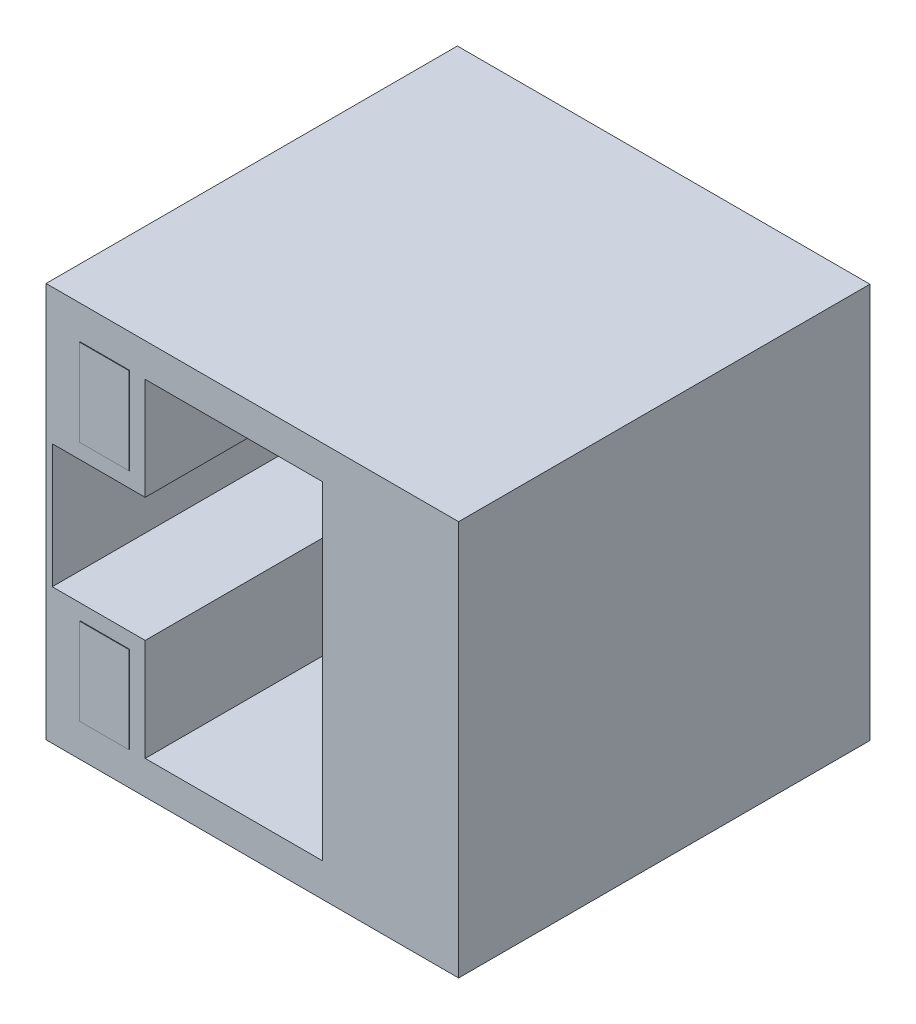
ISO-10303-21;
HEADER;
FILE_DESCRIPTION(('STEP AP214'),'2;1');
FILE_NAME('part.step','',(''),(''),'','','');
FILE_SCHEMA(('AUTOMOTIVE_DESIGN { 1 0 10303 214 1 1 1 1 }'));
ENDSEC;
DATA;
#1=APPLICATION_CONTEXT('core data for automotive mechanical design processes');
#2=APPLICATION_PROTOCOL_DEFINITION('international standard','automotive_design',2000,#1);
#3=PRODUCT_CONTEXT('',#1,'mechanical');
#4=PRODUCT('Part','Part','',(#3));
#5=PRODUCT_RELATED_PRODUCT_CATEGORY('part','',(#4));
#6=PRODUCT_DEFINITION_FORMATION('','',#4);
#7=PRODUCT_DEFINITION_CONTEXT('part definition',#1,'design');
#8=PRODUCT_DEFINITION('design','',#6,#7);
#9=PRODUCT_DEFINITION_SHAPE('','',#8);
#10=(LENGTH_UNIT() NAMED_UNIT(*) SI_UNIT(.MILLI.,.METRE.));
#11=(NAMED_UNIT(*) PLANE_ANGLE_UNIT() SI_UNIT($,.RADIAN.));
#12=(NAMED_UNIT(*) SI_UNIT($,.STERADIAN.) SOLID_ANGLE_UNIT());
#13=UNCERTAINTY_MEASURE_WITH_UNIT(LENGTH_MEASURE(1.E-05),#10,'distance_accuracy_value','');
#14=(GEOMETRIC_REPRESENTATION_CONTEXT(3) GLOBAL_UNCERTAINTY_ASSIGNED_CONTEXT((#13)) GLOBAL_UNIT_ASSIGNED_CONTEXT((#10,
#11,#12)) REPRESENTATION_CONTEXT('',''));
#15=CARTESIAN_POINT('',(0.,0.,0.));
#16=DIRECTION('',(0.,0.,1.));
#17=DIRECTION('',(1.,0.,0.));
#18=AXIS2_PLACEMENT_3D('',#15,#16,#17);
#19=CARTESIAN_POINT('',(8.4582,-8.1026,8.4328));
#20=DIRECTION('',(1.,0.,0.));
#21=DIRECTION('',(0.,0.,-1.));
#22=AXIS2_PLACEMENT_3D('',#19,#20,#21);
#23=PLANE('',#22);
#24=DIRECTION('',(0.,0.,-1.));
#25=VECTOR('',#24,1.);
#26=CARTESIAN_POINT('',(8.4582,8.1026,8.4328));
#27=LINE('',#26,#25);
#28=CARTESIAN_POINT('',(8.4582,8.1026,8.4328));
#29=VERTEX_POINT('',#28);
#30=CARTESIAN_POINT('',(8.4582,8.1026,-8.4328));
#31=VERTEX_POINT('',#30);
#32=EDGE_CURVE('E258',#29,#31,#27,.T.);
#33=ORIENTED_EDGE('',*,*,#32,.F.);
#34=DIRECTION('',(0.,1.,0.));
#35=VECTOR('',#34,1.);
#36=CARTESIAN_POINT('',(8.4582,-8.1026,8.4328));
#37=LINE('',#36,#35);
#38=CARTESIAN_POINT('',(8.4582,-8.1026,8.4328));
#39=VERTEX_POINT('',#38);
#40=EDGE_CURVE('E11',#39,#29,#37,.T.);
#41=ORIENTED_EDGE('',*,*,#40,.F.);
#42=DIRECTION('',(0.,0.,-1.));
#43=VECTOR('',#42,1.);
#44=CARTESIAN_POINT('',(8.4582,-8.1026,8.4328));
#45=LINE('',#44,#43);
#46=CARTESIAN_POINT('',(8.4582,-8.1026,-8.4328));
#47=VERTEX_POINT('',#46);
#48=EDGE_CURVE('E283',#39,#47,#45,.T.);
#49=ORIENTED_EDGE('',*,*,#48,.T.);
#50=DIRECTION('',(0.,1.,0.));
#51=VECTOR('',#50,1.);
#52=CARTESIAN_POINT('',(8.4582,-8.1026,-8.4328));
#53=LINE('',#52,#51);
#54=EDGE_CURVE('E35',#47,#31,#53,.T.);
#55=ORIENTED_EDGE('',*,*,#54,.T.);
#56=EDGE_LOOP('',(#33,#41,#49,#55));
#57=FACE_BOUND('',#56,.T.);
#58=ADVANCED_FACE('F32',(#57),#23,.T.);
#59=CARTESIAN_POINT('',(-8.4582,-8.1026,8.4328));
#60=DIRECTION('',(0.,0.,1.));
#61=DIRECTION('',(1.,0.,0.));
#62=AXIS2_PLACEMENT_3D('',#59,#60,#61);
#63=PLANE('',#62);
#64=DIRECTION('',(0.,1.,0.));
#65=VECTOR('',#64,1.);
#66=CARTESIAN_POINT('',(-8.2042,-2.54,8.4328));
#67=LINE('',#66,#65);
#68=CARTESIAN_POINT('',(-8.2042,-2.54,8.4328));
#69=VERTEX_POINT('',#68);
#70=CARTESIAN_POINT('',(-8.2042,2.54,8.4328));
#71=VERTEX_POINT('',#70);
#72=EDGE_CURVE('E181',#69,#71,#67,.T.);
#73=ORIENTED_EDGE('',*,*,#72,.T.);
#74=DIRECTION('',(1.,0.,0.));
#75=VECTOR('',#74,1.);
#76=CARTESIAN_POINT('',(-8.2042,2.54,8.4328));
#77=LINE('',#76,#75);
#78=CARTESIAN_POINT('',(-4.3942,2.54,8.4328));
#79=VERTEX_POINT('',#78);
#80=EDGE_CURVE('E167',#71,#79,#77,.T.);
#81=ORIENTED_EDGE('',*,*,#80,.T.);
#82=DIRECTION('',(0.,1.,0.));
#83=VECTOR('',#82,1.);
#84=CARTESIAN_POINT('',(-4.3942,2.54,8.4328));
#85=LINE('',#84,#83);
#86=CARTESIAN_POINT('',(-4.3942,6.731,8.4328));
#87=VERTEX_POINT('',#86);
#88=EDGE_CURVE('E595',#79,#87,#85,.T.);
#89=ORIENTED_EDGE('',*,*,#88,.T.);
#90=DIRECTION('',(1.,0.,0.));
#91=VECTOR('',#90,1.);
#92=CARTESIAN_POINT('',(-4.3942,6.731,8.4328));
#93=LINE('',#92,#91);
#94=CARTESIAN_POINT('',(2.8702,6.731,8.4328));
#95=VERTEX_POINT('',#94);
#96=EDGE_CURVE('E592',#87,#95,#93,.T.);
#97=ORIENTED_EDGE('',*,*,#96,.T.);
#98=DIRECTION('',(0.,-1.,0.));
#99=VECTOR('',#98,1.);
#100=CARTESIAN_POINT('',(2.8702,6.731,8.4328));
#101=LINE('',#100,#99);
#102=CARTESIAN_POINT('',(2.8702,-6.731,8.4328));
#103=VERTEX_POINT('',#102);
#104=EDGE_CURVE('E589',#95,#103,#101,.T.);
#105=ORIENTED_EDGE('',*,*,#104,.T.);
#106=DIRECTION('',(-1.,0.,0.));
#107=VECTOR('',#106,1.);
#108=CARTESIAN_POINT('',(2.8702,-6.731,8.4328));
#109=LINE('',#108,#107);
#110=CARTESIAN_POINT('',(-4.3942,-6.731,8.4328));
#111=VERTEX_POINT('',#110);
#112=EDGE_CURVE('E587',#103,#111,#109,.T.);
#113=ORIENTED_EDGE('',*,*,#112,.T.);
#114=DIRECTION('',(0.,1.,0.));
#115=VECTOR('',#114,1.);
#116=CARTESIAN_POINT('',(-4.3942,-6.731,8.4328));
#117=LINE('',#116,#115);
#118=CARTESIAN_POINT('',(-4.3942,-2.54,8.4328));
#119=VERTEX_POINT('',#118);
#120=EDGE_CURVE('E194',#111,#119,#117,.T.);
#121=ORIENTED_EDGE('',*,*,#120,.T.);
#122=DIRECTION('',(-1.,0.,0.));
#123=VECTOR('',#122,1.);
#124=CARTESIAN_POINT('',(-4.3942,-2.54,8.4328));
#125=LINE('',#124,#123);
#126=EDGE_CURVE('E190',#119,#69,#125,.T.);
#127=ORIENTED_EDGE('',*,*,#126,.T.);
#128=EDGE_LOOP('',(#73,#81,#89,#97,#105,#113,#121,#127));
#129=FACE_BOUND('',#128,.T.);
#130=DIRECTION('',(1.,0.,0.));
#131=VECTOR('',#130,1.);
#132=CARTESIAN_POINT('',(-5.0292,6.731,8.43279999998003));
#133=LINE('',#132,#131);
#134=CARTESIAN_POINT('',(-7.0612,6.731,8.4328));
#135=VERTEX_POINT('',#134);
#136=CARTESIAN_POINT('',(-5.0292,6.731,8.43279999998003));
#137=VERTEX_POINT('',#136);
#138=EDGE_CURVE('E245',#135,#137,#133,.T.);
#139=ORIENTED_EDGE('',*,*,#138,.T.);
#140=DIRECTION('',(0.,-1.,0.));
#141=VECTOR('',#140,1.);
#142=CARTESIAN_POINT('',(-5.0292,3.175,8.43279999998003));
#143=LINE('',#142,#141);
#144=CARTESIAN_POINT('',(-5.0292,3.175,8.4328));
#145=VERTEX_POINT('',#144);
#146=EDGE_CURVE('E175',#137,#145,#143,.T.);
#147=ORIENTED_EDGE('',*,*,#146,.T.);
#148=DIRECTION('',(-1.,0.,0.));
#149=VECTOR('',#148,1.);
#150=CARTESIAN_POINT('',(-7.0612,3.175,8.43279999998003));
#151=LINE('',#150,#149);
#152=CARTESIAN_POINT('',(-7.0612,3.175,8.4328));
#153=VERTEX_POINT('',#152);
#154=EDGE_CURVE('E252',#145,#153,#151,.T.);
#155=ORIENTED_EDGE('',*,*,#154,.T.);
#156=DIRECTION('',(0.,1.,0.));
#157=VECTOR('',#156,1.);
#158=CARTESIAN_POINT('',(-7.0612,6.731,8.43279999998003));
#159=LINE('',#158,#157);
#160=EDGE_CURVE('E56',#153,#135,#159,.T.);
#161=ORIENTED_EDGE('',*,*,#160,.T.);
#162=EDGE_LOOP('',(#139,#147,#155,#161));
#163=FACE_BOUND('',#162,.T.);
#164=DIRECTION('',(1.,0.,0.));
#165=VECTOR('',#164,1.);
#166=CARTESIAN_POINT('',(-5.0292,-3.175,8.43279999998003));
#167=LINE('',#166,#165);
#168=CARTESIAN_POINT('',(-7.0612,-3.175,8.4328));
#169=VERTEX_POINT('',#168);
#170=CARTESIAN_POINT('',(-5.0292,-3.175,8.43279999998003));
#171=VERTEX_POINT('',#170);
#172=EDGE_CURVE('E272',#169,#171,#167,.T.);
#173=ORIENTED_EDGE('',*,*,#172,.T.);
#174=DIRECTION('',(0.,-1.,0.));
#175=VECTOR('',#174,1.);
#176=CARTESIAN_POINT('',(-5.0292,-6.731,8.43279999998003));
#177=LINE('',#176,#175);
#178=CARTESIAN_POINT('',(-5.0292,-6.731,8.4328));
#179=VERTEX_POINT('',#178);
#180=EDGE_CURVE('E231',#171,#179,#177,.T.);
#181=ORIENTED_EDGE('',*,*,#180,.T.);
#182=DIRECTION('',(-1.,0.,0.));
#183=VECTOR('',#182,1.);
#184=CARTESIAN_POINT('',(-7.0612,-6.731,8.43279999998003));
#185=LINE('',#184,#183);
#186=CARTESIAN_POINT('',(-7.0612,-6.731,8.4328));
#187=VERTEX_POINT('',#186);
#188=EDGE_CURVE('E280',#179,#187,#185,.T.);
#189=ORIENTED_EDGE('',*,*,#188,.T.);
#190=DIRECTION('',(0.,1.,0.));
#191=VECTOR('',#190,1.);
#192=CARTESIAN_POINT('',(-7.0612,-3.175,8.43279999998003));
#193=LINE('',#192,#191);
#194=EDGE_CURVE('E278',#187,#169,#193,.T.);
#195=ORIENTED_EDGE('',*,*,#194,.T.);
#196=EDGE_LOOP('',(#173,#181,#189,#195));
#197=FACE_BOUND('',#196,.T.);
#198=DIRECTION('',(1.,0.,0.));
#199=VECTOR('',#198,1.);
#200=CARTESIAN_POINT('',(-8.4582,8.1026,8.4328));
#201=LINE('',#200,#199);
#202=CARTESIAN_POINT('',(-8.4582,8.1026,8.4328));
#203=VERTEX_POINT('',#202);
#204=EDGE_CURVE('E287',#203,#29,#201,.T.);
#205=ORIENTED_EDGE('',*,*,#204,.F.);
#206=DIRECTION('',(0.,1.,0.));
#207=VECTOR('',#206,1.);
#208=CARTESIAN_POINT('',(-8.4582,-8.1026,8.4328));
#209=LINE('',#208,#207);
#210=CARTESIAN_POINT('',(-8.4582,-8.1026,8.4328));
#211=VERTEX_POINT('',#210);
#212=EDGE_CURVE('E40',#211,#203,#209,.T.);
#213=ORIENTED_EDGE('',*,*,#212,.F.);
#214=DIRECTION('',(1.,0.,0.));
#215=VECTOR('',#214,1.);
#216=CARTESIAN_POINT('',(-8.4582,-8.1026,8.4328));
#217=LINE('',#216,#215);
#218=EDGE_CURVE('E293',#211,#39,#217,.T.);
#219=ORIENTED_EDGE('',*,*,#218,.T.);
#220=ORIENTED_EDGE('',*,*,#40,.T.);
#221=EDGE_LOOP('',(#205,#213,#219,#220));
#222=FACE_BOUND('',#221,.T.);
#223=ADVANCED_FACE('F188',(#129,#163,#197,#222),#63,.T.);
#224=CARTESIAN_POINT('',(-8.4582,-8.1026,-8.4328));
#225=DIRECTION('',(-1.,0.,0.));
#226=DIRECTION('',(0.,0.,1.));
#227=AXIS2_PLACEMENT_3D('',#224,#225,#226);
#228=PLANE('',#227);
#229=DIRECTION('',(0.,0.,1.));
#230=VECTOR('',#229,1.);
#231=CARTESIAN_POINT('',(-8.4582,8.1026,-8.4328));
#232=LINE('',#231,#230);
#233=CARTESIAN_POINT('',(-8.4582,8.1026,-8.4328));
#234=VERTEX_POINT('',#233);
#235=EDGE_CURVE('E301',#234,#203,#232,.T.);
#236=ORIENTED_EDGE('',*,*,#235,.F.);
#237=DIRECTION('',(0.,1.,0.));
#238=VECTOR('',#237,1.);
#239=CARTESIAN_POINT('',(-8.4582,-8.1026,-8.4328));
#240=LINE('',#239,#238);
#241=CARTESIAN_POINT('',(-8.4582,-8.1026,-8.4328));
#242=VERTEX_POINT('',#241);
#243=EDGE_CURVE('E306',#242,#234,#240,.T.);
#244=ORIENTED_EDGE('',*,*,#243,.F.);
#245=DIRECTION('',(0.,0.,1.));
#246=VECTOR('',#245,1.);
#247=CARTESIAN_POINT('',(-8.4582,-8.1026,-8.4328));
#248=LINE('',#247,#246);
#249=EDGE_CURVE('E290',#242,#211,#248,.T.);
#250=ORIENTED_EDGE('',*,*,#249,.T.);
#251=ORIENTED_EDGE('',*,*,#212,.T.);
#252=EDGE_LOOP('',(#236,#244,#250,#251));
#253=FACE_BOUND('',#252,.T.);
#254=ADVANCED_FACE('F324',(#253),#228,.T.);
#255=CARTESIAN_POINT('',(8.4582,-8.1026,-8.4328));
#256=DIRECTION('',(0.,0.,-1.));
#257=DIRECTION('',(-1.,0.,0.));
#258=AXIS2_PLACEMENT_3D('',#255,#256,#257);
#259=PLANE('',#258);
#260=DIRECTION('',(-1.,0.,0.));
#261=VECTOR('',#260,1.);
#262=CARTESIAN_POINT('',(8.4582,8.1026,-8.4328));
#263=LINE('',#262,#261);
#264=EDGE_CURVE('E298',#31,#234,#263,.T.);
#265=ORIENTED_EDGE('',*,*,#264,.F.);
#266=ORIENTED_EDGE('',*,*,#54,.F.);
#267=DIRECTION('',(-1.,0.,0.));
#268=VECTOR('',#267,1.);
#269=CARTESIAN_POINT('',(8.4582,-8.1026,-8.4328));
#270=LINE('',#269,#268);
#271=EDGE_CURVE('E286',#47,#242,#270,.T.);
#272=ORIENTED_EDGE('',*,*,#271,.T.);
#273=ORIENTED_EDGE('',*,*,#243,.T.);
#274=EDGE_LOOP('',(#265,#266,#272,#273));
#275=FACE_BOUND('',#274,.T.);
#276=ADVANCED_FACE('F314',(#275),#259,.T.);
#277=CARTESIAN_POINT('',(8.4582,-8.1026,-8.4328));
#278=DIRECTION('',(0.,1.,0.));
#279=DIRECTION('',(0.,0.,1.));
#280=AXIS2_PLACEMENT_3D('',#277,#278,#279);
#281=PLANE('',#280);
#282=ORIENTED_EDGE('',*,*,#48,.F.);
#283=ORIENTED_EDGE('',*,*,#218,.F.);
#284=ORIENTED_EDGE('',*,*,#249,.F.);
#285=ORIENTED_EDGE('',*,*,#271,.F.);
#286=EDGE_LOOP('',(#282,#283,#284,#285));
#287=FACE_BOUND('',#286,.T.);
#288=ADVANCED_FACE('F321',(#287),#281,.F.);
#289=CARTESIAN_POINT('',(8.4582,8.1026,-8.4328));
#290=DIRECTION('',(0.,1.,0.));
#291=DIRECTION('',(0.,0.,1.));
#292=AXIS2_PLACEMENT_3D('',#289,#290,#291);
#293=PLANE('',#292);
#294=ORIENTED_EDGE('',*,*,#32,.T.);
#295=ORIENTED_EDGE('',*,*,#264,.T.);
#296=ORIENTED_EDGE('',*,*,#235,.T.);
#297=ORIENTED_EDGE('',*,*,#204,.T.);
#298=EDGE_LOOP('',(#294,#295,#296,#297));
#299=FACE_BOUND('',#298,.T.);
#300=ADVANCED_FACE('F316',(#299),#293,.T.);
#301=CARTESIAN_POINT('',(-5.0292,-3.175,-500000.));
#302=DIRECTION('',(0.,1.,0.));
#303=DIRECTION('',(0.,0.,1.));
#304=AXIS2_PLACEMENT_3D('',#301,#302,#303);
#305=PLANE('',#304);
#306=ORIENTED_EDGE('',*,*,#172,.F.);
#307=DIRECTION('',(0.,0.,1.));
#308=VECTOR('',#307,1.);
#309=CARTESIAN_POINT('',(-7.0612,-3.175,-500000.));
#310=LINE('',#309,#308);
#311=CARTESIAN_POINT('',(-7.0612,-3.175,8.4582));
#312=VERTEX_POINT('',#311);
#313=EDGE_CURVE('E269',#169,#312,#310,.T.);
#314=ORIENTED_EDGE('',*,*,#313,.T.);
#315=DIRECTION('',(-1.,0.,0.));
#316=VECTOR('',#315,1.);
#317=CARTESIAN_POINT('',(-5.0292,-3.175,8.4582));
#318=LINE('',#317,#316);
#319=CARTESIAN_POINT('',(-5.0292,-3.175,8.4582));
#320=VERTEX_POINT('',#319);
#321=EDGE_CURVE('E255',#320,#312,#318,.T.);
#322=ORIENTED_EDGE('',*,*,#321,.F.);
#323=DIRECTION('',(0.,0.,1.));
#324=VECTOR('',#323,1.);
#325=CARTESIAN_POINT('',(-5.0292,-3.175,-500000.));
#326=LINE('',#325,#324);
#327=EDGE_CURVE('E264',#171,#320,#326,.T.);
#328=ORIENTED_EDGE('',*,*,#327,.F.);
#329=EDGE_LOOP('',(#306,#314,#322,#328));
#330=FACE_BOUND('',#329,.T.);
#331=ADVANCED_FACE('F441',(#330),#305,.T.);
#332=CARTESIAN_POINT('',(-7.0612,-3.175,-500000.));
#333=DIRECTION('',(-1.,0.,0.));
#334=DIRECTION('',(0.,0.,1.));
#335=AXIS2_PLACEMENT_3D('',#332,#333,#334);
#336=PLANE('',#335);
#337=ORIENTED_EDGE('',*,*,#194,.F.);
#338=DIRECTION('',(0.,0.,1.));
#339=VECTOR('',#338,1.);
#340=CARTESIAN_POINT('',(-7.0612,-6.731,-500000.));
#341=LINE('',#340,#339);
#342=CARTESIAN_POINT('',(-7.0612,-6.731,8.4582));
#343=VERTEX_POINT('',#342);
#344=EDGE_CURVE('E271',#187,#343,#341,.T.);
#345=ORIENTED_EDGE('',*,*,#344,.T.);
#346=DIRECTION('',(0.,-1.,0.));
#347=VECTOR('',#346,1.);
#348=CARTESIAN_POINT('',(-7.0612,-3.175,8.4582));
#349=LINE('',#348,#347);
#350=EDGE_CURVE('E259',#312,#343,#349,.T.);
#351=ORIENTED_EDGE('',*,*,#350,.F.);
#352=ORIENTED_EDGE('',*,*,#313,.F.);
#353=EDGE_LOOP('',(#337,#345,#351,#352));
#354=FACE_BOUND('',#353,.T.);
#355=ADVANCED_FACE('F463',(#354),#336,.T.);
#356=CARTESIAN_POINT('',(-7.0612,-6.731,-500000.));
#357=DIRECTION('',(0.,-1.,0.));
#358=DIRECTION('',(0.,0.,-1.));
#359=AXIS2_PLACEMENT_3D('',#356,#357,#358);
#360=PLANE('',#359);
#361=ORIENTED_EDGE('',*,*,#188,.F.);
#362=DIRECTION('',(0.,0.,1.));
#363=VECTOR('',#362,1.);
#364=CARTESIAN_POINT('',(-5.0292,-6.731,-500000.));
#365=LINE('',#364,#363);
#366=CARTESIAN_POINT('',(-5.0292,-6.731,8.4582));
#367=VERTEX_POINT('',#366);
#368=EDGE_CURVE('E274',#179,#367,#365,.T.);
#369=ORIENTED_EDGE('',*,*,#368,.T.);
#370=DIRECTION('',(1.,0.,0.));
#371=VECTOR('',#370,1.);
#372=CARTESIAN_POINT('',(-7.0612,-6.731,8.4582));
#373=LINE('',#372,#371);
#374=EDGE_CURVE('E263',#343,#367,#373,.T.);
#375=ORIENTED_EDGE('',*,*,#374,.F.);
#376=ORIENTED_EDGE('',*,*,#344,.F.);
#377=EDGE_LOOP('',(#361,#369,#375,#376));
#378=FACE_BOUND('',#377,.T.);
#379=ADVANCED_FACE('F467',(#378),#360,.T.);
#380=CARTESIAN_POINT('',(-5.0292,-6.731,-500000.));
#381=DIRECTION('',(1.,0.,0.));
#382=DIRECTION('',(0.,0.,-1.));
#383=AXIS2_PLACEMENT_3D('',#380,#381,#382);
#384=PLANE('',#383);
#385=ORIENTED_EDGE('',*,*,#180,.F.);
#386=ORIENTED_EDGE('',*,*,#327,.T.);
#387=DIRECTION('',(0.,1.,0.));
#388=VECTOR('',#387,1.);
#389=CARTESIAN_POINT('',(-5.0292,-6.731,8.4582));
#390=LINE('',#389,#388);
#391=EDGE_CURVE('E260',#367,#320,#390,.T.);
#392=ORIENTED_EDGE('',*,*,#391,.F.);
#393=ORIENTED_EDGE('',*,*,#368,.F.);
#394=EDGE_LOOP('',(#385,#386,#392,#393));
#395=FACE_BOUND('',#394,.T.);
#396=ADVANCED_FACE('F459',(#395),#384,.T.);
#397=CARTESIAN_POINT('',(-7.0612,-3.175,8.4582));
#398=DIRECTION('',(0.,0.,1.));
#399=DIRECTION('',(1.,0.,0.));
#400=AXIS2_PLACEMENT_3D('',#397,#398,#399);
#401=PLANE('',#400);
#402=ORIENTED_EDGE('',*,*,#321,.T.);
#403=ORIENTED_EDGE('',*,*,#350,.T.);
#404=ORIENTED_EDGE('',*,*,#374,.T.);
#405=ORIENTED_EDGE('',*,*,#391,.T.);
#406=EDGE_LOOP('',(#402,#403,#404,#405));
#407=FACE_BOUND('',#406,.T.);
#408=ADVANCED_FACE('F445',(#407),#401,.T.);
#409=CARTESIAN_POINT('',(-5.0292,6.731,-500000.));
#410=DIRECTION('',(0.,1.,0.));
#411=DIRECTION('',(0.,0.,1.));
#412=AXIS2_PLACEMENT_3D('',#409,#410,#411);
#413=PLANE('',#412);
#414=ORIENTED_EDGE('',*,*,#138,.F.);
#415=DIRECTION('',(0.,0.,1.));
#416=VECTOR('',#415,1.);
#417=CARTESIAN_POINT('',(-7.0612,6.731,-500000.));
#418=LINE('',#417,#416);
#419=CARTESIAN_POINT('',(-7.0612,6.731,8.4582));
#420=VERTEX_POINT('',#419);
#421=EDGE_CURVE('E242',#135,#420,#418,.T.);
#422=ORIENTED_EDGE('',*,*,#421,.T.);
#423=DIRECTION('',(-1.,0.,0.));
#424=VECTOR('',#423,1.);
#425=CARTESIAN_POINT('',(-5.0292,6.731,8.4582));
#426=LINE('',#425,#424);
#427=CARTESIAN_POINT('',(-5.0292,6.731,8.4582));
#428=VERTEX_POINT('',#427);
#429=EDGE_CURVE('E228',#428,#420,#426,.T.);
#430=ORIENTED_EDGE('',*,*,#429,.F.);
#431=DIRECTION('',(0.,0.,1.));
#432=VECTOR('',#431,1.);
#433=CARTESIAN_POINT('',(-5.0292,6.731,-500000.));
#434=LINE('',#433,#432);
#435=EDGE_CURVE('E237',#137,#428,#434,.T.);
#436=ORIENTED_EDGE('',*,*,#435,.F.);
#437=EDGE_LOOP('',(#414,#422,#430,#436));
#438=FACE_BOUND('',#437,.T.);
#439=ADVANCED_FACE('F357',(#438),#413,.T.);
#440=CARTESIAN_POINT('',(-7.0612,6.731,-500000.));
#441=DIRECTION('',(-1.,0.,0.));
#442=DIRECTION('',(0.,0.,1.));
#443=AXIS2_PLACEMENT_3D('',#440,#441,#442);
#444=PLANE('',#443);
#445=ORIENTED_EDGE('',*,*,#160,.F.);
#446=DIRECTION('',(0.,0.,1.));
#447=VECTOR('',#446,1.);
#448=CARTESIAN_POINT('',(-7.0612,3.175,-500000.));
#449=LINE('',#448,#447);
#450=CARTESIAN_POINT('',(-7.0612,3.175,8.4582));
#451=VERTEX_POINT('',#450);
#452=EDGE_CURVE('E244',#153,#451,#449,.T.);
#453=ORIENTED_EDGE('',*,*,#452,.T.);
#454=DIRECTION('',(0.,-1.,0.));
#455=VECTOR('',#454,1.);
#456=CARTESIAN_POINT('',(-7.0612,6.731,8.4582));
#457=LINE('',#456,#455);
#458=EDGE_CURVE('E232',#420,#451,#457,.T.);
#459=ORIENTED_EDGE('',*,*,#458,.F.);
#460=ORIENTED_EDGE('',*,*,#421,.F.);
#461=EDGE_LOOP('',(#445,#453,#459,#460));
#462=FACE_BOUND('',#461,.T.);
#463=ADVANCED_FACE('F444',(#462),#444,.T.);
#464=CARTESIAN_POINT('',(-7.0612,3.175,-500000.));
#465=DIRECTION('',(0.,-1.,0.));
#466=DIRECTION('',(0.,0.,-1.));
#467=AXIS2_PLACEMENT_3D('',#464,#465,#466);
#468=PLANE('',#467);
#469=ORIENTED_EDGE('',*,*,#154,.F.);
#470=DIRECTION('',(0.,0.,1.));
#471=VECTOR('',#470,1.);
#472=CARTESIAN_POINT('',(-5.0292,3.175,-500000.));
#473=LINE('',#472,#471);
#474=CARTESIAN_POINT('',(-5.0292,3.175,8.4582));
#475=VERTEX_POINT('',#474);
#476=EDGE_CURVE('E247',#145,#475,#473,.T.);
#477=ORIENTED_EDGE('',*,*,#476,.T.);
#478=DIRECTION('',(1.,0.,0.));
#479=VECTOR('',#478,1.);
#480=CARTESIAN_POINT('',(-7.0612,3.175,8.4582));
#481=LINE('',#480,#479);
#482=EDGE_CURVE('E236',#451,#475,#481,.T.);
#483=ORIENTED_EDGE('',*,*,#482,.F.);
#484=ORIENTED_EDGE('',*,*,#452,.F.);
#485=EDGE_LOOP('',(#469,#477,#483,#484));
#486=FACE_BOUND('',#485,.T.);
#487=ADVANCED_FACE('F449',(#486),#468,.T.);
#488=CARTESIAN_POINT('',(-5.0292,3.175,-500000.));
#489=DIRECTION('',(1.,0.,0.));
#490=DIRECTION('',(0.,0.,-1.));
#491=AXIS2_PLACEMENT_3D('',#488,#489,#490);
#492=PLANE('',#491);
#493=ORIENTED_EDGE('',*,*,#146,.F.);
#494=ORIENTED_EDGE('',*,*,#435,.T.);
#495=DIRECTION('',(0.,1.,0.));
#496=VECTOR('',#495,1.);
#497=CARTESIAN_POINT('',(-5.0292,3.175,8.4582));
#498=LINE('',#497,#496);
#499=EDGE_CURVE('E233',#475,#428,#498,.T.);
#500=ORIENTED_EDGE('',*,*,#499,.F.);
#501=ORIENTED_EDGE('',*,*,#476,.F.);
#502=EDGE_LOOP('',(#493,#494,#500,#501));
#503=FACE_BOUND('',#502,.T.);
#504=ADVANCED_FACE('F439',(#503),#492,.T.);
#505=CARTESIAN_POINT('',(-7.0612,6.731,8.4582));
#506=DIRECTION('',(0.,0.,1.));
#507=DIRECTION('',(1.,0.,0.));
#508=AXIS2_PLACEMENT_3D('',#505,#506,#507);
#509=PLANE('',#508);
#510=ORIENTED_EDGE('',*,*,#429,.T.);
#511=ORIENTED_EDGE('',*,*,#458,.T.);
#512=ORIENTED_EDGE('',*,*,#482,.T.);
#513=ORIENTED_EDGE('',*,*,#499,.T.);
#514=EDGE_LOOP('',(#510,#511,#512,#513));
#515=FACE_BOUND('',#514,.T.);
#516=ADVANCED_FACE('F346',(#515),#509,.T.);
#517=CARTESIAN_POINT('',(-8.2042,-2.54,8.4592));
#518=DIRECTION('',(-1.,0.,0.));
#519=DIRECTION('',(0.,0.,1.));
#520=AXIS2_PLACEMENT_3D('',#517,#518,#519);
#521=PLANE('',#520);
#522=DIRECTION('',(0.,0.,-1.));
#523=VECTOR('',#522,1.);
#524=CARTESIAN_POINT('',(-8.2042,-2.54,8.4592));
#525=LINE('',#524,#523);
#526=CARTESIAN_POINT('',(-8.2042,-2.54,-1.7272));
#527=VERTEX_POINT('',#526);
#528=EDGE_CURVE('E176',#69,#527,#525,.T.);
#529=ORIENTED_EDGE('',*,*,#528,.T.);
#530=DIRECTION('',(0.,1.,0.));
#531=VECTOR('',#530,1.);
#532=CARTESIAN_POINT('',(-8.2042,-2.54,-1.7272));
#533=LINE('',#532,#531);
#534=CARTESIAN_POINT('',(-8.2042,2.54,-1.7272));
#535=VERTEX_POINT('',#534);
#536=EDGE_CURVE('E184',#527,#535,#533,.T.);
#537=ORIENTED_EDGE('',*,*,#536,.T.);
#538=DIRECTION('',(0.,0.,-1.));
#539=VECTOR('',#538,1.);
#540=CARTESIAN_POINT('',(-8.2042,2.54,8.4592));
#541=LINE('',#540,#539);
#542=EDGE_CURVE('E170',#71,#535,#541,.T.);
#543=ORIENTED_EDGE('',*,*,#542,.F.);
#544=ORIENTED_EDGE('',*,*,#72,.F.);
#545=EDGE_LOOP('',(#529,#537,#543,#544));
#546=FACE_BOUND('',#545,.T.);
#547=ADVANCED_FACE('F180',(#546),#521,.F.);
#548=CARTESIAN_POINT('',(-4.3942,-2.54,8.4592));
#549=DIRECTION('',(0.,-1.,0.));
#550=DIRECTION('',(0.,0.,-1.));
#551=AXIS2_PLACEMENT_3D('',#548,#549,#550);
#552=PLANE('',#551);
#553=DIRECTION('',(0.,0.,-1.));
#554=VECTOR('',#553,1.);
#555=CARTESIAN_POINT('',(-4.3942,-2.54,8.4592));
#556=LINE('',#555,#554);
#557=CARTESIAN_POINT('',(-4.3942,-2.54,-1.7272));
#558=VERTEX_POINT('',#557);
#559=EDGE_CURVE('E217',#119,#558,#556,.T.);
#560=ORIENTED_EDGE('',*,*,#559,.T.);
#561=DIRECTION('',(-1.,0.,0.));
#562=VECTOR('',#561,1.);
#563=CARTESIAN_POINT('',(-4.3942,-2.54,-1.7272));
#564=LINE('',#563,#562);
#565=EDGE_CURVE('E185',#558,#527,#564,.T.);
#566=ORIENTED_EDGE('',*,*,#565,.T.);
#567=ORIENTED_EDGE('',*,*,#528,.F.);
#568=ORIENTED_EDGE('',*,*,#126,.F.);
#569=EDGE_LOOP('',(#560,#566,#567,#568));
#570=FACE_BOUND('',#569,.T.);
#571=ADVANCED_FACE('F355',(#570),#552,.F.);
#572=CARTESIAN_POINT('',(-4.3942,-6.731,8.4592));
#573=DIRECTION('',(-1.,0.,0.));
#574=DIRECTION('',(0.,0.,1.));
#575=AXIS2_PLACEMENT_3D('',#572,#573,#574);
#576=PLANE('',#575);
#577=DIRECTION('',(0.,0.,-1.));
#578=VECTOR('',#577,1.);
#579=CARTESIAN_POINT('',(-4.3942,-6.731,8.4592));
#580=LINE('',#579,#578);
#581=CARTESIAN_POINT('',(-4.3942,-6.731,-1.7272));
#582=VERTEX_POINT('',#581);
#583=EDGE_CURVE('E219',#111,#582,#580,.T.);
#584=ORIENTED_EDGE('',*,*,#583,.T.);
#585=DIRECTION('',(0.,1.,0.));
#586=VECTOR('',#585,1.);
#587=CARTESIAN_POINT('',(-4.3942,-6.731,-1.7272));
#588=LINE('',#587,#586);
#589=EDGE_CURVE('E211',#582,#558,#588,.T.);
#590=ORIENTED_EDGE('',*,*,#589,.T.);
#591=ORIENTED_EDGE('',*,*,#559,.F.);
#592=ORIENTED_EDGE('',*,*,#120,.F.);
#593=EDGE_LOOP('',(#584,#590,#591,#592));
#594=FACE_BOUND('',#593,.T.);
#595=ADVANCED_FACE('F365',(#594),#576,.F.);
#596=CARTESIAN_POINT('',(2.8702,-6.731,8.4592));
#597=DIRECTION('',(0.,-1.,0.));
#598=DIRECTION('',(0.,0.,-1.));
#599=AXIS2_PLACEMENT_3D('',#596,#597,#598);
#600=PLANE('',#599);
#601=DIRECTION('',(0.,0.,-1.));
#602=VECTOR('',#601,1.);
#603=CARTESIAN_POINT('',(2.8702,-6.731,8.4592));
#604=LINE('',#603,#602);
#605=CARTESIAN_POINT('',(2.8702,-6.731,-1.7272));
#606=VERTEX_POINT('',#605);
#607=EDGE_CURVE('E221',#103,#606,#604,.T.);
#608=ORIENTED_EDGE('',*,*,#607,.T.);
#609=DIRECTION('',(-1.,0.,0.));
#610=VECTOR('',#609,1.);
#611=CARTESIAN_POINT('',(2.8702,-6.731,-1.7272));
#612=LINE('',#611,#610);
#613=EDGE_CURVE('E208',#606,#582,#612,.T.);
#614=ORIENTED_EDGE('',*,*,#613,.T.);
#615=ORIENTED_EDGE('',*,*,#583,.F.);
#616=ORIENTED_EDGE('',*,*,#112,.F.);
#617=EDGE_LOOP('',(#608,#614,#615,#616));
#618=FACE_BOUND('',#617,.T.);
#619=ADVANCED_FACE('F375',(#618),#600,.F.);
#620=CARTESIAN_POINT('',(2.8702,6.731,8.4592));
#621=DIRECTION('',(1.,0.,0.));
#622=DIRECTION('',(0.,1.,0.));
#623=AXIS2_PLACEMENT_3D('',#620,#621,#622);
#624=PLANE('',#623);
#625=DIRECTION('',(0.,0.,-1.));
#626=VECTOR('',#625,1.);
#627=CARTESIAN_POINT('',(2.8702,6.731,8.4592));
#628=LINE('',#627,#626);
#629=CARTESIAN_POINT('',(2.8702,6.731,-1.7272));
#630=VERTEX_POINT('',#629);
#631=EDGE_CURVE('E223',#95,#630,#628,.T.);
#632=ORIENTED_EDGE('',*,*,#631,.T.);
#633=DIRECTION('',(0.,-1.,0.));
#634=VECTOR('',#633,1.);
#635=CARTESIAN_POINT('',(2.8702,6.731,-1.7272));
#636=LINE('',#635,#634);
#637=EDGE_CURVE('E205',#630,#606,#636,.T.);
#638=ORIENTED_EDGE('',*,*,#637,.T.);
#639=ORIENTED_EDGE('',*,*,#607,.F.);
#640=ORIENTED_EDGE('',*,*,#104,.F.);
#641=EDGE_LOOP('',(#632,#638,#639,#640));
#642=FACE_BOUND('',#641,.T.);
#643=ADVANCED_FACE('F385',(#642),#624,.F.);
#644=CARTESIAN_POINT('',(-4.3942,6.731,8.4592));
#645=DIRECTION('',(0.,1.,0.));
#646=DIRECTION('',(0.,0.,1.));
#647=AXIS2_PLACEMENT_3D('',#644,#645,#646);
#648=PLANE('',#647);
#649=DIRECTION('',(0.,0.,-1.));
#650=VECTOR('',#649,1.);
#651=CARTESIAN_POINT('',(-4.3942,6.731,8.4592));
#652=LINE('',#651,#650);
#653=CARTESIAN_POINT('',(-4.3942,6.731,-1.7272));
#654=VERTEX_POINT('',#653);
#655=EDGE_CURVE('E225',#87,#654,#652,.T.);
#656=ORIENTED_EDGE('',*,*,#655,.T.);
#657=DIRECTION('',(1.,0.,0.));
#658=VECTOR('',#657,1.);
#659=CARTESIAN_POINT('',(-4.3942,6.731,-1.7272));
#660=LINE('',#659,#658);
#661=EDGE_CURVE('E202',#654,#630,#660,.T.);
#662=ORIENTED_EDGE('',*,*,#661,.T.);
#663=ORIENTED_EDGE('',*,*,#631,.F.);
#664=ORIENTED_EDGE('',*,*,#96,.F.);
#665=EDGE_LOOP('',(#656,#662,#663,#664));
#666=FACE_BOUND('',#665,.T.);
#667=ADVANCED_FACE('F395',(#666),#648,.F.);
#668=CARTESIAN_POINT('',(-4.3942,2.54,8.4592));
#669=DIRECTION('',(-1.,0.,0.));
#670=DIRECTION('',(0.,-1.,0.));
#671=AXIS2_PLACEMENT_3D('',#668,#669,#670);
#672=PLANE('',#671);
#673=DIRECTION('',(0.,0.,-1.));
#674=VECTOR('',#673,1.);
#675=CARTESIAN_POINT('',(-4.3942,2.54,8.4592));
#676=LINE('',#675,#674);
#677=CARTESIAN_POINT('',(-4.3942,2.54,-1.7272));
#678=VERTEX_POINT('',#677);
#679=EDGE_CURVE('E48',#79,#678,#676,.T.);
#680=ORIENTED_EDGE('',*,*,#679,.T.);
#681=DIRECTION('',(0.,1.,0.));
#682=VECTOR('',#681,1.);
#683=CARTESIAN_POINT('',(-4.3942,2.54,-1.7272));
#684=LINE('',#683,#682);
#685=EDGE_CURVE('E199',#678,#654,#684,.T.);
#686=ORIENTED_EDGE('',*,*,#685,.T.);
#687=ORIENTED_EDGE('',*,*,#655,.F.);
#688=ORIENTED_EDGE('',*,*,#88,.F.);
#689=EDGE_LOOP('',(#680,#686,#687,#688));
#690=FACE_BOUND('',#689,.T.);
#691=ADVANCED_FACE('F405',(#690),#672,.F.);
#692=CARTESIAN_POINT('',(-8.2042,2.54,8.4592));
#693=DIRECTION('',(0.,1.,0.));
#694=DIRECTION('',(0.,0.,1.));
#695=AXIS2_PLACEMENT_3D('',#692,#693,#694);
#696=PLANE('',#695);
#697=ORIENTED_EDGE('',*,*,#542,.T.);
#698=DIRECTION('',(1.,0.,0.));
#699=VECTOR('',#698,1.);
#700=CARTESIAN_POINT('',(-8.2042,2.54,-1.7272));
#701=LINE('',#700,#699);
#702=EDGE_CURVE('E192',#535,#678,#701,.T.);
#703=ORIENTED_EDGE('',*,*,#702,.T.);
#704=ORIENTED_EDGE('',*,*,#679,.F.);
#705=ORIENTED_EDGE('',*,*,#80,.F.);
#706=EDGE_LOOP('',(#697,#703,#704,#705));
#707=FACE_BOUND('',#706,.T.);
#708=ADVANCED_FACE('F169',(#707),#696,.F.);
#709=CARTESIAN_POINT('',(-8.2042,2.54,-1.7272));
#710=DIRECTION('',(0.,0.,-1.));
#711=DIRECTION('',(-1.,0.,0.));
#712=AXIS2_PLACEMENT_3D('',#709,#710,#711);
#713=PLANE('',#712);
#714=ORIENTED_EDGE('',*,*,#536,.F.);
#715=ORIENTED_EDGE('',*,*,#565,.F.);
#716=ORIENTED_EDGE('',*,*,#589,.F.);
#717=ORIENTED_EDGE('',*,*,#613,.F.);
#718=ORIENTED_EDGE('',*,*,#637,.F.);
#719=ORIENTED_EDGE('',*,*,#661,.F.);
#720=ORIENTED_EDGE('',*,*,#685,.F.);
#721=ORIENTED_EDGE('',*,*,#702,.F.);
#722=EDGE_LOOP('',(#714,#715,#716,#717,#718,#719,#720,#721));
#723=FACE_BOUND('',#722,.T.);
#724=ADVANCED_FACE('F424',(#723),#713,.F.);
#725=CLOSED_SHELL('',(#58,#223,#254,#276,#288,#300,#331,#355,#379,#396,#408,#439,#463,#487,#504,
#516,#547,#571,#595,#619,#643,#667,#691,#708,#724));
#726=MANIFOLD_SOLID_BREP('B2',#725);
#727=ADVANCED_BREP_SHAPE_REPRESENTATION('',(#18,#726),#14);
#728=SHAPE_DEFINITION_REPRESENTATION(#9,#727);
ENDSEC;
END-ISO-10303-21;
